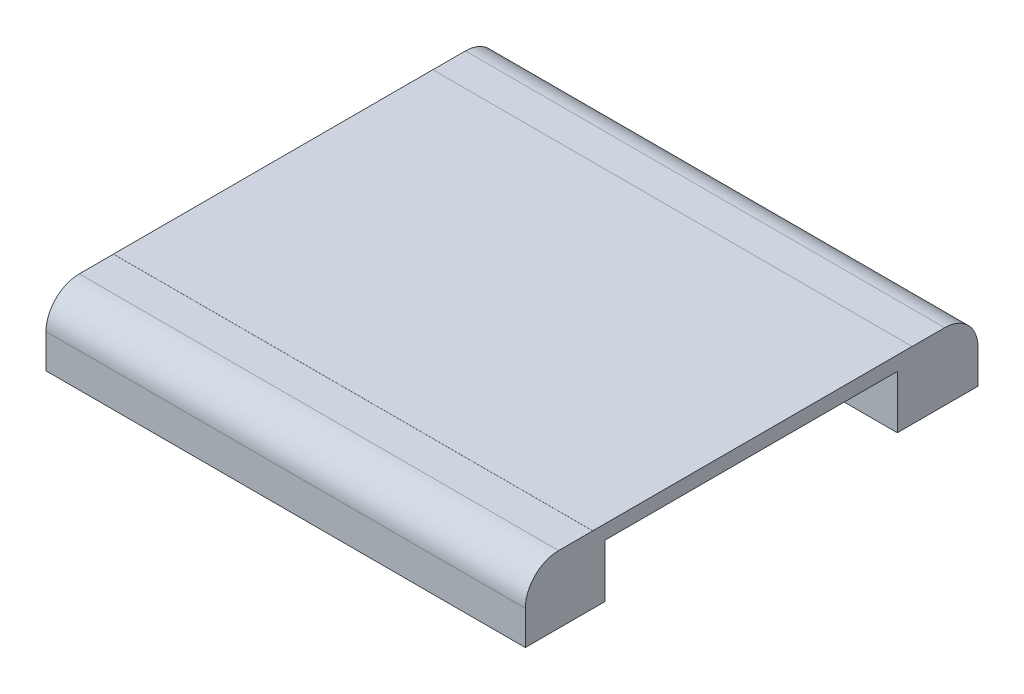
ISO-10303-21;
HEADER;
FILE_DESCRIPTION(('STEP AP214'),'2;1');
FILE_NAME('part.step','',(''),(''),'','','');
FILE_SCHEMA(('AUTOMOTIVE_DESIGN { 1 0 10303 214 1 1 1 1 }'));
ENDSEC;
DATA;
#1=APPLICATION_CONTEXT('core data for automotive mechanical design processes');
#2=APPLICATION_PROTOCOL_DEFINITION('international standard','automotive_design',2000,#1);
#3=PRODUCT_CONTEXT('',#1,'mechanical');
#4=PRODUCT('Part','Part','',(#3));
#5=PRODUCT_RELATED_PRODUCT_CATEGORY('part','',(#4));
#6=PRODUCT_DEFINITION_FORMATION('','',#4);
#7=PRODUCT_DEFINITION_CONTEXT('part definition',#1,'design');
#8=PRODUCT_DEFINITION('design','',#6,#7);
#9=PRODUCT_DEFINITION_SHAPE('','',#8);
#10=(LENGTH_UNIT() NAMED_UNIT(*) SI_UNIT(.MILLI.,.METRE.));
#11=(NAMED_UNIT(*) PLANE_ANGLE_UNIT() SI_UNIT($,.RADIAN.));
#12=(NAMED_UNIT(*) SI_UNIT($,.STERADIAN.) SOLID_ANGLE_UNIT());
#13=UNCERTAINTY_MEASURE_WITH_UNIT(LENGTH_MEASURE(1.E-05),#10,'distance_accuracy_value','');
#14=(GEOMETRIC_REPRESENTATION_CONTEXT(3) GLOBAL_UNCERTAINTY_ASSIGNED_CONTEXT((#13)) GLOBAL_UNIT_ASSIGNED_CONTEXT((#10,
#11,#12)) REPRESENTATION_CONTEXT('',''));
#15=CARTESIAN_POINT('',(0.,0.,0.));
#16=DIRECTION('',(0.,0.,1.));
#17=DIRECTION('',(1.,0.,0.));
#18=AXIS2_PLACEMENT_3D('',#15,#16,#17);
#19=CARTESIAN_POINT('',(18.,-0.0578125220072959,28.0241501159373));
#20=DIRECTION('',(0.,1.,0.));
#21=DIRECTION('',(0.,0.,1.));
#22=AXIS2_PLACEMENT_3D('',#19,#20,#21);
#23=PLANE('',#22);
#24=DIRECTION('',(0.,0.,-1.));
#25=VECTOR('',#24,1.);
#26=CARTESIAN_POINT('',(-18.,-0.0578125220072959,34.));
#27=LINE('',#26,#25);
#28=CARTESIAN_POINT('',(-18.,-0.0578125220072959,34.));
#29=VERTEX_POINT('',#28);
#30=CARTESIAN_POINT('',(-18.,-0.0578125220072959,28.0241501159373));
#31=VERTEX_POINT('',#30);
#32=EDGE_CURVE('E454',#29,#31,#27,.T.);
#33=ORIENTED_EDGE('',*,*,#32,.T.);
#34=DIRECTION('',(1.,0.,0.));
#35=VECTOR('',#34,1.);
#36=CARTESIAN_POINT('',(-40.325568237644,-0.0578125220072959,28.0241501159373));
#37=LINE('',#36,#35);
#38=CARTESIAN_POINT('',(18.,-0.0578125220072959,28.0241501159373));
#39=VERTEX_POINT('',#38);
#40=EDGE_CURVE('E11',#31,#39,#37,.T.);
#41=ORIENTED_EDGE('',*,*,#40,.T.);
#42=DIRECTION('',(0.,0.,-1.));
#43=VECTOR('',#42,1.);
#44=CARTESIAN_POINT('',(18.,-0.0578125220072959,34.));
#45=LINE('',#44,#43);
#46=CARTESIAN_POINT('',(18.,-0.0578125220072959,34.));
#47=VERTEX_POINT('',#46);
#48=EDGE_CURVE('E53',#47,#39,#45,.T.);
#49=ORIENTED_EDGE('',*,*,#48,.F.);
#50=DIRECTION('',(-1.,0.,0.));
#51=VECTOR('',#50,1.);
#52=CARTESIAN_POINT('',(0.,-0.0578125220072959,34.));
#53=LINE('',#52,#51);
#54=EDGE_CURVE('E453',#47,#29,#53,.T.);
#55=ORIENTED_EDGE('',*,*,#54,.T.);
#56=EDGE_LOOP('',(#33,#41,#49,#55));
#57=FACE_BOUND('',#56,.T.);
#58=DIRECTION('',(0.,0.,-1.));
#59=VECTOR('',#58,1.);
#60=CARTESIAN_POINT('',(17.,-0.0578125220072959,34.));
#61=LINE('',#60,#59);
#62=CARTESIAN_POINT('',(17.,-0.0578125220072959,33.));
#63=VERTEX_POINT('',#62);
#64=CARTESIAN_POINT('',(17.,-0.0578125220072959,28.9356904364668));
#65=VERTEX_POINT('',#64);
#66=EDGE_CURVE('E485',#63,#65,#61,.T.);
#67=ORIENTED_EDGE('',*,*,#66,.T.);
#68=DIRECTION('',(1.,0.,0.));
#69=VECTOR('',#68,1.);
#70=CARTESIAN_POINT('',(42.7233396122521,-0.0578125220072959,28.9356904364668));
#71=LINE('',#70,#69);
#72=CARTESIAN_POINT('',(-17.,-0.0578125220072959,28.9356904364668));
#73=VERTEX_POINT('',#72);
#74=EDGE_CURVE('E478',#73,#65,#71,.T.);
#75=ORIENTED_EDGE('',*,*,#74,.F.);
#76=DIRECTION('',(0.,0.,-1.));
#77=VECTOR('',#76,1.);
#78=CARTESIAN_POINT('',(-17.,-0.0578125220072959,34.));
#79=LINE('',#78,#77);
#80=CARTESIAN_POINT('',(-17.,-0.0578125220072959,33.));
#81=VERTEX_POINT('',#80);
#82=EDGE_CURVE('E467',#81,#73,#79,.T.);
#83=ORIENTED_EDGE('',*,*,#82,.F.);
#84=DIRECTION('',(-1.,0.,0.));
#85=VECTOR('',#84,1.);
#86=CARTESIAN_POINT('',(0.,-0.0578125220072959,33.));
#87=LINE('',#86,#85);
#88=CARTESIAN_POINT('',(7.80627689891058,-0.0578125220072959,33.));
#89=VERTEX_POINT('',#88);
#90=EDGE_CURVE('E468',#89,#81,#87,.T.);
#91=ORIENTED_EDGE('',*,*,#90,.F.);
#92=DIRECTION('',(-0.707040858821482,0.,0.707172697406356));
#93=VECTOR('',#92,1.);
#94=CARTESIAN_POINT('',(7.80627689891058,-0.0578125220072959,33.));
#95=LINE('',#94,#93);
#96=CARTESIAN_POINT('',(7.83796469042223,-0.0578125220072959,32.9683062998148));
#97=VERTEX_POINT('',#96);
#98=EDGE_CURVE('E449',#97,#89,#95,.T.);
#99=ORIENTED_EDGE('',*,*,#98,.F.);
#100=DIRECTION('',(1.,0.,0.));
#101=VECTOR('',#100,1.);
#102=CARTESIAN_POINT('',(13.9400122350262,-0.0578125220072959,32.9683062998148));
#103=LINE('',#102,#101);
#104=CARTESIAN_POINT('',(4.85968181109299,-0.0578125220072959,32.9683062998148));
#105=VERTEX_POINT('',#104);
#106=EDGE_CURVE('E464',#105,#97,#103,.T.);
#107=ORIENTED_EDGE('',*,*,#106,.F.);
#108=DIRECTION('',(-0.68267317744641,0.,0.73072384167702));
#109=VECTOR('',#108,1.);
#110=CARTESIAN_POINT('',(4.85968181109299,-0.0578125220072959,32.9683062998148));
#111=LINE('',#110,#109);
#112=CARTESIAN_POINT('',(7.40340874838498,-0.0578125220072959,30.2455364866692));
#113=VERTEX_POINT('',#112);
#114=EDGE_CURVE('E471',#113,#105,#111,.T.);
#115=ORIENTED_EDGE('',*,*,#114,.F.);
#116=DIRECTION('',(-1.,0.,0.));
#117=VECTOR('',#116,1.);
#118=CARTESIAN_POINT('',(12.3591776077276,-0.0578125220072959,30.2455364866692));
#119=LINE('',#118,#117);
#120=CARTESIAN_POINT('',(13.9400122350262,-0.0578125220072959,30.2455364866692));
#121=VERTEX_POINT('',#120);
#122=EDGE_CURVE('E474',#121,#113,#119,.T.);
#123=ORIENTED_EDGE('',*,*,#122,.F.);
#124=DIRECTION('',(0.,0.,-1.));
#125=VECTOR('',#124,1.);
#126=CARTESIAN_POINT('',(13.9400122350262,-0.0578125220072959,30.2455364866692));
#127=LINE('',#126,#125);
#128=CARTESIAN_POINT('',(13.9400122350262,-0.0578125220072959,32.9683062998148));
#129=VERTEX_POINT('',#128);
#130=EDGE_CURVE('E473',#129,#121,#127,.T.);
#131=ORIENTED_EDGE('',*,*,#130,.F.);
#132=DIRECTION('',(1.,0.,0.));
#133=VECTOR('',#132,1.);
#134=CARTESIAN_POINT('',(13.9400122350262,-0.0578125220072959,32.9683062998148));
#135=LINE('',#134,#133);
#136=CARTESIAN_POINT('',(11.5237850289689,-0.0578125220072959,32.9683062998148));
#137=VERTEX_POINT('',#136);
#138=EDGE_CURVE('E466',#137,#129,#135,.T.);
#139=ORIENTED_EDGE('',*,*,#138,.F.);
#140=DIRECTION('',(0.,0.,-1.));
#141=VECTOR('',#140,1.);
#142=CARTESIAN_POINT('',(11.5237850289689,-0.0578125220072959,31.9372937490459));
#143=LINE('',#142,#141);
#144=CARTESIAN_POINT('',(11.5237850289689,-0.0578125220072959,33.));
#145=VERTEX_POINT('',#144);
#146=EDGE_CURVE('E463',#145,#137,#143,.T.);
#147=ORIENTED_EDGE('',*,*,#146,.F.);
#148=DIRECTION('',(-1.,0.,0.));
#149=VECTOR('',#148,1.);
#150=CARTESIAN_POINT('',(0.,-0.0578125220072959,33.));
#151=LINE('',#150,#149);
#152=EDGE_CURVE('E470',#63,#145,#151,.T.);
#153=ORIENTED_EDGE('',*,*,#152,.F.);
#154=EDGE_LOOP('',(#67,#75,#83,#91,#99,#107,#115,#123,#131,#139,#147,#153));
#155=FACE_BOUND('',#154,.T.);
#156=ADVANCED_FACE('F36',(#57,#155),#23,.F.);
#157=DIRECTION('',(1.,0.,0.));
#158=VECTOR('',#157,1.);
#159=CARTESIAN_POINT('',(-40.325568237644,-0.0578125220072959,6.05869530103713));
#160=LINE('',#159,#158);
#161=CARTESIAN_POINT('',(-18.,-0.0578125220072959,6.05869530103713));
#162=VERTEX_POINT('',#161);
#163=CARTESIAN_POINT('',(18.,-0.0578125220072959,6.05869530103713));
#164=VERTEX_POINT('',#163);
#165=EDGE_CURVE('E278',#162,#164,#160,.T.);
#166=ORIENTED_EDGE('',*,*,#165,.F.);
#167=CARTESIAN_POINT('',(-18.,-0.0578125220072959,0.));
#168=VERTEX_POINT('',#167);
#169=EDGE_CURVE('E450',#162,#168,#27,.T.);
#170=ORIENTED_EDGE('',*,*,#169,.T.);
#171=DIRECTION('',(-1.,0.,0.));
#172=VECTOR('',#171,1.);
#173=CARTESIAN_POINT('',(0.,-0.0578125220072959,0.));
#174=LINE('',#173,#172);
#175=CARTESIAN_POINT('',(18.,-0.0578125220072959,0.));
#176=VERTEX_POINT('',#175);
#177=EDGE_CURVE('E455',#176,#168,#174,.T.);
#178=ORIENTED_EDGE('',*,*,#177,.F.);
#179=EDGE_CURVE('E457',#164,#176,#45,.T.);
#180=ORIENTED_EDGE('',*,*,#179,.F.);
#181=EDGE_LOOP('',(#166,#170,#178,#180));
#182=FACE_BOUND('',#181,.T.);
#183=DIRECTION('',(-1.,0.,0.));
#184=VECTOR('',#183,1.);
#185=CARTESIAN_POINT('',(42.7233396122521,-0.0578125220072959,4.950527908569));
#186=LINE('',#185,#184);
#187=CARTESIAN_POINT('',(17.,-0.0578125220072959,4.95052790856901));
#188=VERTEX_POINT('',#187);
#189=CARTESIAN_POINT('',(-17.,-0.0578125220072959,4.95052790856901));
#190=VERTEX_POINT('',#189);
#191=EDGE_CURVE('E40',#188,#190,#186,.T.);
#192=ORIENTED_EDGE('',*,*,#191,.F.);
#193=CARTESIAN_POINT('',(17.,-0.0578125220072959,1.));
#194=VERTEX_POINT('',#193);
#195=EDGE_CURVE('E481',#188,#194,#61,.T.);
#196=ORIENTED_EDGE('',*,*,#195,.T.);
#197=DIRECTION('',(-1.,0.,0.));
#198=VECTOR('',#197,1.);
#199=CARTESIAN_POINT('',(0.,-0.0578125220072959,1.));
#200=LINE('',#199,#198);
#201=CARTESIAN_POINT('',(2.52238131463829,-0.0578125220072959,1.));
#202=VERTEX_POINT('',#201);
#203=EDGE_CURVE('E495',#194,#202,#200,.T.);
#204=ORIENTED_EDGE('',*,*,#203,.T.);
#205=DIRECTION('',(-0.756635368845266,0.,0.653837073445968));
#206=VECTOR('',#205,1.);
#207=CARTESIAN_POINT('',(2.54458171045212,-0.0578125220072959,0.980815803191426));
#208=LINE('',#207,#206);
#209=CARTESIAN_POINT('',(-0.105019187153202,-0.0578125220072959,3.27043556988826));
#210=VERTEX_POINT('',#209);
#211=EDGE_CURVE('E461',#202,#210,#208,.T.);
#212=ORIENTED_EDGE('',*,*,#211,.T.);
#213=DIRECTION('',(-1.,0.,0.));
#214=VECTOR('',#213,1.);
#215=CARTESIAN_POINT('',(-0.105019187153202,-0.0578125220072959,3.27043556988826));
#216=LINE('',#215,#214);
#217=CARTESIAN_POINT('',(-3.68350976570056,-0.0578125220072959,3.27043556988826));
#218=VERTEX_POINT('',#217);
#219=EDGE_CURVE('E490',#210,#218,#216,.T.);
#220=ORIENTED_EDGE('',*,*,#219,.T.);
#221=DIRECTION('',(-0.653837073445968,0.,-0.756635368845266));
#222=VECTOR('',#221,1.);
#223=CARTESIAN_POINT('',(-3.68350976570056,-0.0578125220072959,3.27043556988826));
#224=LINE('',#223,#222);
#225=CARTESIAN_POINT('',(-5.64547851523037,-0.0578125220072959,1.));
#226=VERTEX_POINT('',#225);
#227=EDGE_CURVE('E45',#218,#226,#224,.T.);
#228=ORIENTED_EDGE('',*,*,#227,.T.);
#229=DIRECTION('',(-1.,0.,0.));
#230=VECTOR('',#229,1.);
#231=CARTESIAN_POINT('',(0.,-0.0578125220072959,1.));
#232=LINE('',#231,#230);
#233=CARTESIAN_POINT('',(-17.,-0.0578125220072959,1.));
#234=VERTEX_POINT('',#233);
#235=EDGE_CURVE('E484',#226,#234,#232,.T.);
#236=ORIENTED_EDGE('',*,*,#235,.T.);
#237=EDGE_CURVE('E459',#190,#234,#79,.T.);
#238=ORIENTED_EDGE('',*,*,#237,.F.);
#239=EDGE_LOOP('',(#192,#196,#204,#212,#220,#228,#236,#238));
#240=FACE_BOUND('',#239,.T.);
#241=ADVANCED_FACE('F38',(#182,#240),#23,.F.);
#242=CARTESIAN_POINT('',(-18.,5.,34.));
#243=DIRECTION('',(0.,1.,0.));
#244=DIRECTION('',(0.,0.,1.));
#245=AXIS2_PLACEMENT_3D('',#242,#243,#244);
#246=PLANE('',#245);
#247=DIRECTION('',(0.,0.,-1.));
#248=VECTOR('',#247,1.);
#249=CARTESIAN_POINT('',(-18.,5.,34.));
#250=LINE('',#249,#248);
#251=CARTESIAN_POINT('',(-18.,5.,31.5));
#252=VERTEX_POINT('',#251);
#253=CARTESIAN_POINT('',(-18.,5.,28.9356904364668));
#254=VERTEX_POINT('',#253);
#255=EDGE_CURVE('E412',#252,#254,#250,.T.);
#256=ORIENTED_EDGE('',*,*,#255,.F.);
#257=DIRECTION('',(1.,0.,0.));
#258=VECTOR('',#257,1.);
#259=CARTESIAN_POINT('',(-18.,5.,31.5));
#260=LINE('',#259,#258);
#261=CARTESIAN_POINT('',(18.,5.,31.5));
#262=VERTEX_POINT('',#261);
#263=EDGE_CURVE('E422',#252,#262,#260,.T.);
#264=ORIENTED_EDGE('',*,*,#263,.T.);
#265=DIRECTION('',(0.,0.,-1.));
#266=VECTOR('',#265,1.);
#267=CARTESIAN_POINT('',(18.,5.,34.));
#268=LINE('',#267,#266);
#269=CARTESIAN_POINT('',(18.,5.,28.9356904364668));
#270=VERTEX_POINT('',#269);
#271=EDGE_CURVE('E416',#262,#270,#268,.T.);
#272=ORIENTED_EDGE('',*,*,#271,.T.);
#273=DIRECTION('',(-1.,0.,0.));
#274=VECTOR('',#273,1.);
#275=CARTESIAN_POINT('',(-18.,5.,28.9356904364668));
#276=LINE('',#275,#274);
#277=EDGE_CURVE('E376',#270,#254,#276,.T.);
#278=ORIENTED_EDGE('',*,*,#277,.T.);
#279=EDGE_LOOP('',(#256,#264,#272,#278));
#280=FACE_BOUND('',#279,.T.);
#281=ADVANCED_FACE('F545',(#280),#246,.T.);
#282=CARTESIAN_POINT('',(42.7233396122521,5.00470007375512,28.9356904364668));
#283=DIRECTION('',(0.,0.,-1.));
#284=DIRECTION('',(0.,1.,0.));
#285=AXIS2_PLACEMENT_3D('',#282,#283,#284);
#286=PLANE('',#285);
#287=ORIENTED_EDGE('',*,*,#277,.F.);
#288=DIRECTION('',(0.,1.,0.));
#289=VECTOR('',#288,1.);
#290=CARTESIAN_POINT('',(18.,5.00470007375512,28.9356904364668));
#291=LINE('',#290,#289);
#292=CARTESIAN_POINT('',(18.,5.00470007375512,28.9356904364668));
#293=VERTEX_POINT('',#292);
#294=EDGE_CURVE('E352',#270,#293,#291,.T.);
#295=ORIENTED_EDGE('',*,*,#294,.T.);
#296=DIRECTION('',(-1.,0.,0.));
#297=VECTOR('',#296,1.);
#298=CARTESIAN_POINT('',(42.7233396122521,5.00470007375512,28.9356904364668));
#299=LINE('',#298,#297);
#300=CARTESIAN_POINT('',(-18.,5.00470007375512,28.9356904364668));
#301=VERTEX_POINT('',#300);
#302=EDGE_CURVE('E349',#293,#301,#299,.T.);
#303=ORIENTED_EDGE('',*,*,#302,.T.);
#304=DIRECTION('',(0.,-1.,0.));
#305=VECTOR('',#304,1.);
#306=CARTESIAN_POINT('',(-18.,5.00470007375513,28.9356904364668));
#307=LINE('',#306,#305);
#308=EDGE_CURVE('E346',#301,#254,#307,.T.);
#309=ORIENTED_EDGE('',*,*,#308,.T.);
#310=EDGE_LOOP('',(#287,#295,#303,#309));
#311=FACE_BOUND('',#310,.T.);
#312=ADVANCED_FACE('F660',(#311),#286,.F.);
#313=CARTESIAN_POINT('',(42.7233396122521,5.00470007375512,28.9356904364668));
#314=DIRECTION('',(0.,-1.,0.));
#315=DIRECTION('',(0.,0.,-1.));
#316=AXIS2_PLACEMENT_3D('',#313,#314,#315);
#317=PLANE('',#316);
#318=ORIENTED_EDGE('',*,*,#302,.F.);
#319=DIRECTION('',(0.,0.,-1.));
#320=VECTOR('',#319,1.);
#321=CARTESIAN_POINT('',(18.,5.00470007375512,28.9356904364668));
#322=LINE('',#321,#320);
#323=CARTESIAN_POINT('',(18.,5.00470007375512,4.95052790856901));
#324=VERTEX_POINT('',#323);
#325=EDGE_CURVE('E354',#293,#324,#322,.T.);
#326=ORIENTED_EDGE('',*,*,#325,.T.);
#327=DIRECTION('',(-1.,0.,0.));
#328=VECTOR('',#327,1.);
#329=CARTESIAN_POINT('',(42.7233396122521,5.00470007375512,4.950527908569));
#330=LINE('',#329,#328);
#331=CARTESIAN_POINT('',(-18.,5.00470007375512,4.95052790856901));
#332=VERTEX_POINT('',#331);
#333=EDGE_CURVE('E355',#324,#332,#330,.T.);
#334=ORIENTED_EDGE('',*,*,#333,.T.);
#335=DIRECTION('',(0.,0.,1.));
#336=VECTOR('',#335,1.);
#337=CARTESIAN_POINT('',(-18.,5.00470007375512,28.9356904364668));
#338=LINE('',#337,#336);
#339=EDGE_CURVE('E343',#332,#301,#338,.T.);
#340=ORIENTED_EDGE('',*,*,#339,.T.);
#341=EDGE_LOOP('',(#318,#326,#334,#340));
#342=FACE_BOUND('',#341,.T.);
#343=ADVANCED_FACE('F690',(#342),#317,.F.);
#344=CARTESIAN_POINT('',(42.7233396122521,5.00470007375512,4.950527908569));
#345=DIRECTION('',(0.,0.,1.));
#346=DIRECTION('',(0.,-1.,0.));
#347=AXIS2_PLACEMENT_3D('',#344,#345,#346);
#348=PLANE('',#347);
#349=DIRECTION('',(1.,0.,0.));
#350=VECTOR('',#349,1.);
#351=CARTESIAN_POINT('',(-18.,5.,4.950527908569));
#352=LINE('',#351,#350);
#353=CARTESIAN_POINT('',(-18.,5.,4.95052790856901));
#354=VERTEX_POINT('',#353);
#355=CARTESIAN_POINT('',(18.,5.,4.950527908569));
#356=VERTEX_POINT('',#355);
#357=EDGE_CURVE('E368',#354,#356,#352,.T.);
#358=ORIENTED_EDGE('',*,*,#357,.F.);
#359=DIRECTION('',(0.,1.,0.));
#360=VECTOR('',#359,1.);
#361=CARTESIAN_POINT('',(-18.,5.00470007375513,4.950527908569));
#362=LINE('',#361,#360);
#363=EDGE_CURVE('E347',#354,#332,#362,.T.);
#364=ORIENTED_EDGE('',*,*,#363,.T.);
#365=ORIENTED_EDGE('',*,*,#333,.F.);
#366=DIRECTION('',(0.,-1.,0.));
#367=VECTOR('',#366,1.);
#368=CARTESIAN_POINT('',(18.,5.00470007375512,4.950527908569));
#369=LINE('',#368,#367);
#370=EDGE_CURVE('E358',#324,#356,#369,.T.);
#371=ORIENTED_EDGE('',*,*,#370,.T.);
#372=EDGE_LOOP('',(#358,#364,#365,#371));
#373=FACE_BOUND('',#372,.T.);
#374=ADVANCED_FACE('F687',(#373),#348,.F.);
#375=CARTESIAN_POINT('',(18.,5.,2.5));
#376=VERTEX_POINT('',#375);
#377=EDGE_CURVE('E409',#356,#376,#268,.T.);
#378=ORIENTED_EDGE('',*,*,#377,.T.);
#379=DIRECTION('',(-1.,0.,0.));
#380=VECTOR('',#379,1.);
#381=CARTESIAN_POINT('',(-18.,5.,2.5));
#382=LINE('',#381,#380);
#383=CARTESIAN_POINT('',(-18.,5.,2.5));
#384=VERTEX_POINT('',#383);
#385=EDGE_CURVE('E438',#376,#384,#382,.T.);
#386=ORIENTED_EDGE('',*,*,#385,.T.);
#387=EDGE_CURVE('E415',#354,#384,#250,.T.);
#388=ORIENTED_EDGE('',*,*,#387,.F.);
#389=ORIENTED_EDGE('',*,*,#357,.T.);
#390=EDGE_LOOP('',(#378,#386,#388,#389));
#391=FACE_BOUND('',#390,.T.);
#392=ADVANCED_FACE('F662',(#391),#246,.T.);
#393=CARTESIAN_POINT('',(-18.,2.5,31.5));
#394=DIRECTION('',(1.,0.,0.));
#395=DIRECTION('',(0.,0.,-1.));
#396=AXIS2_PLACEMENT_3D('',#393,#394,#395);
#397=CYLINDRICAL_SURFACE('',#396,2.5);
#398=ORIENTED_EDGE('',*,*,#263,.F.);
#399=CARTESIAN_POINT('',(-18.,2.5,31.5));
#400=DIRECTION('',(-1.,0.,0.));
#401=DIRECTION('',(0.,-1.,0.));
#402=AXIS2_PLACEMENT_3D('',#399,#400,#401);
#403=CIRCLE('',#402,2.5);
#404=CARTESIAN_POINT('',(-18.,2.5,34.));
#405=VERTEX_POINT('',#404);
#406=EDGE_CURVE('E428',#405,#252,#403,.T.);
#407=ORIENTED_EDGE('',*,*,#406,.F.);
#408=DIRECTION('',(1.,0.,0.));
#409=VECTOR('',#408,1.);
#410=CARTESIAN_POINT('',(0.,2.5,34.));
#411=LINE('',#410,#409);
#412=CARTESIAN_POINT('',(18.,2.5,34.));
#413=VERTEX_POINT('',#412);
#414=EDGE_CURVE('E425',#413,#405,#411,.F.);
#415=ORIENTED_EDGE('',*,*,#414,.F.);
#416=CARTESIAN_POINT('',(18.,2.5,31.5));
#417=DIRECTION('',(-1.,0.,0.));
#418=DIRECTION('',(0.,0.,1.));
#419=AXIS2_PLACEMENT_3D('',#416,#417,#418);
#420=CIRCLE('',#419,2.5);
#421=EDGE_CURVE('E430',#262,#413,#420,.F.);
#422=ORIENTED_EDGE('',*,*,#421,.F.);
#423=EDGE_LOOP('',(#398,#407,#415,#422));
#424=FACE_BOUND('',#423,.T.);
#425=ADVANCED_FACE('F663',(#424),#397,.T.);
#426=CARTESIAN_POINT('',(-18.,2.5,2.5));
#427=DIRECTION('',(1.,0.,0.));
#428=DIRECTION('',(0.,0.,-1.));
#429=AXIS2_PLACEMENT_3D('',#426,#427,#428);
#430=CYLINDRICAL_SURFACE('',#429,2.5);
#431=ORIENTED_EDGE('',*,*,#385,.F.);
#432=CARTESIAN_POINT('',(18.,2.5,2.5));
#433=DIRECTION('',(-1.,0.,0.));
#434=DIRECTION('',(0.,0.,1.));
#435=AXIS2_PLACEMENT_3D('',#432,#433,#434);
#436=CIRCLE('',#435,2.5);
#437=CARTESIAN_POINT('',(18.,2.5,0.));
#438=VERTEX_POINT('',#437);
#439=EDGE_CURVE('E444',#438,#376,#436,.F.);
#440=ORIENTED_EDGE('',*,*,#439,.F.);
#441=DIRECTION('',(-1.,0.,0.));
#442=VECTOR('',#441,1.);
#443=CARTESIAN_POINT('',(-18.,2.5,0.));
#444=LINE('',#443,#442);
#445=CARTESIAN_POINT('',(-18.,2.5,0.));
#446=VERTEX_POINT('',#445);
#447=EDGE_CURVE('E441',#446,#438,#444,.F.);
#448=ORIENTED_EDGE('',*,*,#447,.F.);
#449=CARTESIAN_POINT('',(-18.,2.5,2.5));
#450=DIRECTION('',(-1.,0.,0.));
#451=DIRECTION('',(0.,-1.,0.));
#452=AXIS2_PLACEMENT_3D('',#449,#450,#451);
#453=CIRCLE('',#452,2.5);
#454=EDGE_CURVE('E446',#384,#446,#453,.T.);
#455=ORIENTED_EDGE('',*,*,#454,.F.);
#456=EDGE_LOOP('',(#431,#440,#448,#455));
#457=FACE_BOUND('',#456,.T.);
#458=ADVANCED_FACE('F654',(#457),#430,.T.);
#459=CARTESIAN_POINT('',(-18.,-5.,34.));
#460=DIRECTION('',(-1.,0.,0.));
#461=DIRECTION('',(0.,-1.,0.));
#462=AXIS2_PLACEMENT_3D('',#459,#460,#461);
#463=PLANE('',#462);
#464=ORIENTED_EDGE('',*,*,#32,.F.);
#465=DIRECTION('',(0.,1.,0.));
#466=VECTOR('',#465,1.);
#467=CARTESIAN_POINT('',(-18.,-5.,34.));
#468=LINE('',#467,#466);
#469=EDGE_CURVE('E406',#29,#405,#468,.T.);
#470=ORIENTED_EDGE('',*,*,#469,.T.);
#471=ORIENTED_EDGE('',*,*,#406,.T.);
#472=ORIENTED_EDGE('',*,*,#255,.T.);
#473=ORIENTED_EDGE('',*,*,#308,.F.);
#474=ORIENTED_EDGE('',*,*,#339,.F.);
#475=ORIENTED_EDGE('',*,*,#363,.F.);
#476=ORIENTED_EDGE('',*,*,#387,.T.);
#477=ORIENTED_EDGE('',*,*,#454,.T.);
#478=DIRECTION('',(0.,1.,0.));
#479=VECTOR('',#478,1.);
#480=CARTESIAN_POINT('',(-18.,-5.,0.));
#481=LINE('',#480,#479);
#482=EDGE_CURVE('E407',#168,#446,#481,.T.);
#483=ORIENTED_EDGE('',*,*,#482,.F.);
#484=ORIENTED_EDGE('',*,*,#169,.F.);
#485=DIRECTION('',(0.,1.,0.));
#486=VECTOR('',#485,1.);
#487=CARTESIAN_POINT('',(-18.,3.93590653524728,6.05869530103713));
#488=LINE('',#487,#486);
#489=CARTESIAN_POINT('',(-18.,3.93590653524727,6.05869530103713));
#490=VERTEX_POINT('',#489);
#491=EDGE_CURVE('E271',#162,#490,#488,.T.);
#492=ORIENTED_EDGE('',*,*,#491,.T.);
#493=DIRECTION('',(0.,0.,1.));
#494=VECTOR('',#493,1.);
#495=CARTESIAN_POINT('',(-18.,3.93590653524727,28.0241501159373));
#496=LINE('',#495,#494);
#497=CARTESIAN_POINT('',(-18.,3.93590653524727,28.0241501159373));
#498=VERTEX_POINT('',#497);
#499=EDGE_CURVE('E266',#490,#498,#496,.T.);
#500=ORIENTED_EDGE('',*,*,#499,.T.);
#501=DIRECTION('',(0.,-1.,0.));
#502=VECTOR('',#501,1.);
#503=CARTESIAN_POINT('',(-18.,3.93590653524728,28.0241501159373));
#504=LINE('',#503,#502);
#505=EDGE_CURVE('E288',#498,#31,#504,.T.);
#506=ORIENTED_EDGE('',*,*,#505,.T.);
#507=EDGE_LOOP('',(#464,#470,#471,#472,#473,#474,#475,#476,#477,#483,#484,#492,#500,#506));
#508=FACE_BOUND('',#507,.T.);
#509=ADVANCED_FACE('F651',(#508),#463,.T.);
#510=CARTESIAN_POINT('',(-40.325568237644,3.93590653524727,28.0241501159373));
#511=DIRECTION('',(0.,1.,0.));
#512=DIRECTION('',(0.,0.,1.));
#513=AXIS2_PLACEMENT_3D('',#510,#511,#512);
#514=PLANE('',#513);
#515=DIRECTION('',(1.,0.,0.));
#516=VECTOR('',#515,1.);
#517=CARTESIAN_POINT('',(-40.325568237644,3.93590653524727,6.05869530103713));
#518=LINE('',#517,#516);
#519=CARTESIAN_POINT('',(18.,3.93590653524727,6.05869530103713));
#520=VERTEX_POINT('',#519);
#521=EDGE_CURVE('E259',#490,#520,#518,.T.);
#522=ORIENTED_EDGE('',*,*,#521,.T.);
#523=DIRECTION('',(0.,0.,-1.));
#524=VECTOR('',#523,1.);
#525=CARTESIAN_POINT('',(18.,3.93590653524727,28.0241501159373));
#526=LINE('',#525,#524);
#527=CARTESIAN_POINT('',(18.,3.93590653524727,28.0241501159373));
#528=VERTEX_POINT('',#527);
#529=EDGE_CURVE('E264',#528,#520,#526,.T.);
#530=ORIENTED_EDGE('',*,*,#529,.F.);
#531=DIRECTION('',(1.,0.,0.));
#532=VECTOR('',#531,1.);
#533=CARTESIAN_POINT('',(-40.325568237644,3.93590653524727,28.0241501159373));
#534=LINE('',#533,#532);
#535=EDGE_CURVE('E286',#498,#528,#534,.T.);
#536=ORIENTED_EDGE('',*,*,#535,.F.);
#537=ORIENTED_EDGE('',*,*,#499,.F.);
#538=EDGE_LOOP('',(#522,#530,#536,#537));
#539=FACE_BOUND('',#538,.T.);
#540=ADVANCED_FACE('F261',(#539),#514,.F.);
#541=CARTESIAN_POINT('',(18.,-5.,34.));
#542=DIRECTION('',(-1.,0.,0.));
#543=DIRECTION('',(0.,0.,1.));
#544=AXIS2_PLACEMENT_3D('',#541,#542,#543);
#545=PLANE('',#544);
#546=DIRECTION('',(0.,1.,0.));
#547=VECTOR('',#546,1.);
#548=CARTESIAN_POINT('',(18.,-5.,34.));
#549=LINE('',#548,#547);
#550=EDGE_CURVE('E404',#47,#413,#549,.T.);
#551=ORIENTED_EDGE('',*,*,#550,.F.);
#552=ORIENTED_EDGE('',*,*,#48,.T.);
#553=DIRECTION('',(0.,1.,0.));
#554=VECTOR('',#553,1.);
#555=CARTESIAN_POINT('',(18.,3.93590653524727,28.0241501159373));
#556=LINE('',#555,#554);
#557=EDGE_CURVE('E281',#39,#528,#556,.T.);
#558=ORIENTED_EDGE('',*,*,#557,.T.);
#559=ORIENTED_EDGE('',*,*,#529,.T.);
#560=DIRECTION('',(0.,-1.,0.));
#561=VECTOR('',#560,1.);
#562=CARTESIAN_POINT('',(18.,3.93590653524727,6.05869530103713));
#563=LINE('',#562,#561);
#564=EDGE_CURVE('E275',#520,#164,#563,.T.);
#565=ORIENTED_EDGE('',*,*,#564,.T.);
#566=ORIENTED_EDGE('',*,*,#179,.T.);
#567=DIRECTION('',(0.,1.,0.));
#568=VECTOR('',#567,1.);
#569=CARTESIAN_POINT('',(18.,-5.,0.));
#570=LINE('',#569,#568);
#571=EDGE_CURVE('E387',#176,#438,#570,.T.);
#572=ORIENTED_EDGE('',*,*,#571,.T.);
#573=ORIENTED_EDGE('',*,*,#439,.T.);
#574=ORIENTED_EDGE('',*,*,#377,.F.);
#575=ORIENTED_EDGE('',*,*,#370,.F.);
#576=ORIENTED_EDGE('',*,*,#325,.F.);
#577=ORIENTED_EDGE('',*,*,#294,.F.);
#578=ORIENTED_EDGE('',*,*,#271,.F.);
#579=ORIENTED_EDGE('',*,*,#421,.T.);
#580=EDGE_LOOP('',(#551,#552,#558,#559,#565,#566,#572,#573,#574,#575,#576,#577,#578,#579));
#581=FACE_BOUND('',#580,.T.);
#582=ADVANCED_FACE('F280',(#581),#545,.F.);
#583=CARTESIAN_POINT('',(-40.325568237644,3.93590653524727,6.05869530103713));
#584=DIRECTION('',(0.,0.,-1.));
#585=DIRECTION('',(-1.,0.,0.));
#586=AXIS2_PLACEMENT_3D('',#583,#584,#585);
#587=PLANE('',#586);
#588=ORIENTED_EDGE('',*,*,#165,.T.);
#589=ORIENTED_EDGE('',*,*,#564,.F.);
#590=ORIENTED_EDGE('',*,*,#521,.F.);
#591=ORIENTED_EDGE('',*,*,#491,.F.);
#592=EDGE_LOOP('',(#588,#589,#590,#591));
#593=FACE_BOUND('',#592,.T.);
#594=ADVANCED_FACE('F276',(#593),#587,.F.);
#595=CARTESIAN_POINT('',(-40.325568237644,3.93590653524727,28.0241501159373));
#596=DIRECTION('',(0.,0.,1.));
#597=DIRECTION('',(1.,0.,0.));
#598=AXIS2_PLACEMENT_3D('',#595,#596,#597);
#599=PLANE('',#598);
#600=ORIENTED_EDGE('',*,*,#535,.T.);
#601=ORIENTED_EDGE('',*,*,#557,.F.);
#602=ORIENTED_EDGE('',*,*,#40,.F.);
#603=ORIENTED_EDGE('',*,*,#505,.F.);
#604=EDGE_LOOP('',(#600,#601,#602,#603));
#605=FACE_BOUND('',#604,.T.);
#606=ADVANCED_FACE('F649',(#605),#599,.F.);
#607=CARTESIAN_POINT('',(0.,0.,0.));
#608=DIRECTION('',(0.,0.,1.));
#609=DIRECTION('',(1.,0.,0.));
#610=AXIS2_PLACEMENT_3D('',#607,#608,#609);
#611=PLANE('',#610);
#612=ORIENTED_EDGE('',*,*,#571,.F.);
#613=ORIENTED_EDGE('',*,*,#177,.T.);
#614=ORIENTED_EDGE('',*,*,#482,.T.);
#615=ORIENTED_EDGE('',*,*,#447,.T.);
#616=EDGE_LOOP('',(#612,#613,#614,#615));
#617=FACE_BOUND('',#616,.T.);
#618=ADVANCED_FACE('F633',(#617),#611,.F.);
#619=CARTESIAN_POINT('',(0.,0.,34.));
#620=DIRECTION('',(0.,0.,1.));
#621=DIRECTION('',(1.,0.,0.));
#622=AXIS2_PLACEMENT_3D('',#619,#620,#621);
#623=PLANE('',#622);
#624=ORIENTED_EDGE('',*,*,#54,.F.);
#625=ORIENTED_EDGE('',*,*,#550,.T.);
#626=ORIENTED_EDGE('',*,*,#414,.T.);
#627=ORIENTED_EDGE('',*,*,#469,.F.);
#628=EDGE_LOOP('',(#624,#625,#626,#627));
#629=FACE_BOUND('',#628,.T.);
#630=ADVANCED_FACE('F628',(#629),#623,.T.);
#631=CARTESIAN_POINT('',(-18.,4.,34.));
#632=DIRECTION('',(0.,1.,0.));
#633=DIRECTION('',(0.,0.,1.));
#634=AXIS2_PLACEMENT_3D('',#631,#632,#633);
#635=PLANE('',#634);
#636=DIRECTION('',(0.,0.,-1.));
#637=VECTOR('',#636,1.);
#638=CARTESIAN_POINT('',(11.5237850289689,4.,31.9372937490459));
#639=LINE('',#638,#637);
#640=CARTESIAN_POINT('',(11.5237850289689,4.,33.));
#641=VERTEX_POINT('',#640);
#642=CARTESIAN_POINT('',(11.5237850289689,4.,32.9683062998148));
#643=VERTEX_POINT('',#642);
#644=EDGE_CURVE('E293',#641,#643,#639,.T.);
#645=ORIENTED_EDGE('',*,*,#644,.T.);
#646=DIRECTION('',(-1.,0.,0.));
#647=VECTOR('',#646,1.);
#648=CARTESIAN_POINT('',(13.9400122350262,4.,32.9683062998148));
#649=LINE('',#648,#647);
#650=CARTESIAN_POINT('',(13.9400122350262,4.,32.9683062998148));
#651=VERTEX_POINT('',#650);
#652=EDGE_CURVE('E323',#651,#643,#649,.T.);
#653=ORIENTED_EDGE('',*,*,#652,.F.);
#654=DIRECTION('',(0.,0.,1.));
#655=VECTOR('',#654,1.);
#656=CARTESIAN_POINT('',(13.9400122350262,4.,30.2455364866692));
#657=LINE('',#656,#655);
#658=CARTESIAN_POINT('',(13.9400122350262,4.,30.2455364866692));
#659=VERTEX_POINT('',#658);
#660=EDGE_CURVE('E327',#659,#651,#657,.T.);
#661=ORIENTED_EDGE('',*,*,#660,.F.);
#662=DIRECTION('',(1.,0.,0.));
#663=VECTOR('',#662,1.);
#664=CARTESIAN_POINT('',(12.3591776077276,4.,30.2455364866692));
#665=LINE('',#664,#663);
#666=CARTESIAN_POINT('',(7.40340874838499,4.,30.2455364866692));
#667=VERTEX_POINT('',#666);
#668=EDGE_CURVE('E331',#667,#659,#665,.T.);
#669=ORIENTED_EDGE('',*,*,#668,.F.);
#670=DIRECTION('',(0.68267317744641,0.,-0.73072384167702));
#671=VECTOR('',#670,1.);
#672=CARTESIAN_POINT('',(4.85968181109299,4.,32.9683062998148));
#673=LINE('',#672,#671);
#674=CARTESIAN_POINT('',(4.85968181109299,4.,32.9683062998148));
#675=VERTEX_POINT('',#674);
#676=EDGE_CURVE('E326',#675,#667,#673,.T.);
#677=ORIENTED_EDGE('',*,*,#676,.F.);
#678=CARTESIAN_POINT('',(7.83796469042223,4.,32.9683062998148));
#679=VERTEX_POINT('',#678);
#680=EDGE_CURVE('E321',#679,#675,#649,.T.);
#681=ORIENTED_EDGE('',*,*,#680,.F.);
#682=DIRECTION('',(-0.707040858821482,0.,0.707172697406356));
#683=VECTOR('',#682,1.);
#684=CARTESIAN_POINT('',(7.80627689891058,4.,33.));
#685=LINE('',#684,#683);
#686=CARTESIAN_POINT('',(7.80627689891057,4.,33.));
#687=VERTEX_POINT('',#686);
#688=EDGE_CURVE('E297',#679,#687,#685,.T.);
#689=ORIENTED_EDGE('',*,*,#688,.T.);
#690=DIRECTION('',(1.,0.,0.));
#691=VECTOR('',#690,1.);
#692=CARTESIAN_POINT('',(-18.,4.,33.));
#693=LINE('',#692,#691);
#694=CARTESIAN_POINT('',(-17.,4.,33.));
#695=VERTEX_POINT('',#694);
#696=EDGE_CURVE('E389',#695,#687,#693,.T.);
#697=ORIENTED_EDGE('',*,*,#696,.F.);
#698=DIRECTION('',(0.,0.,-1.));
#699=VECTOR('',#698,1.);
#700=CARTESIAN_POINT('',(-17.,4.,34.));
#701=LINE('',#700,#699);
#702=CARTESIAN_POINT('',(-17.,4.,28.9356904364668));
#703=VERTEX_POINT('',#702);
#704=EDGE_CURVE('E384',#695,#703,#701,.T.);
#705=ORIENTED_EDGE('',*,*,#704,.T.);
#706=DIRECTION('',(-1.,0.,0.));
#707=VECTOR('',#706,1.);
#708=CARTESIAN_POINT('',(-18.,4.,28.9356904364668));
#709=LINE('',#708,#707);
#710=CARTESIAN_POINT('',(17.,4.,28.9356904364668));
#711=VERTEX_POINT('',#710);
#712=EDGE_CURVE('E371',#711,#703,#709,.T.);
#713=ORIENTED_EDGE('',*,*,#712,.F.);
#714=DIRECTION('',(0.,0.,-1.));
#715=VECTOR('',#714,1.);
#716=CARTESIAN_POINT('',(17.,4.,34.));
#717=LINE('',#716,#715);
#718=CARTESIAN_POINT('',(17.,4.,33.));
#719=VERTEX_POINT('',#718);
#720=EDGE_CURVE('E394',#719,#711,#717,.T.);
#721=ORIENTED_EDGE('',*,*,#720,.F.);
#722=EDGE_CURVE('E393',#641,#719,#693,.T.);
#723=ORIENTED_EDGE('',*,*,#722,.F.);
#724=EDGE_LOOP('',(#645,#653,#661,#669,#677,#681,#689,#697,#705,#713,#721,#723));
#725=FACE_BOUND('',#724,.T.);
#726=ADVANCED_FACE('F567',(#725),#635,.F.);
#727=CARTESIAN_POINT('',(0.,0.,33.));
#728=DIRECTION('',(0.,0.,1.));
#729=DIRECTION('',(1.,0.,0.));
#730=AXIS2_PLACEMENT_3D('',#727,#728,#729);
#731=PLANE('',#730);
#732=DIRECTION('',(0.,-1.,0.));
#733=VECTOR('',#732,1.);
#734=CARTESIAN_POINT('',(7.80627689891058,7.86642099012341,33.));
#735=LINE('',#734,#733);
#736=EDGE_CURVE('E270',#687,#89,#735,.T.);
#737=ORIENTED_EDGE('',*,*,#736,.T.);
#738=ORIENTED_EDGE('',*,*,#90,.T.);
#739=DIRECTION('',(0.,1.,0.));
#740=VECTOR('',#739,1.);
#741=CARTESIAN_POINT('',(-17.,-5.,33.));
#742=LINE('',#741,#740);
#743=EDGE_CURVE('E400',#81,#695,#742,.T.);
#744=ORIENTED_EDGE('',*,*,#743,.T.);
#745=ORIENTED_EDGE('',*,*,#696,.T.);
#746=EDGE_LOOP('',(#737,#738,#744,#745));
#747=FACE_BOUND('',#746,.T.);
#748=ADVANCED_FACE('F578',(#747),#731,.F.);
#749=CARTESIAN_POINT('',(13.9400122350262,-3.2,32.9683062998148));
#750=DIRECTION('',(0.,0.,-1.));
#751=DIRECTION('',(-1.,0.,0.));
#752=AXIS2_PLACEMENT_3D('',#749,#750,#751);
#753=PLANE('',#752);
#754=DIRECTION('',(0.,1.,0.));
#755=VECTOR('',#754,1.);
#756=CARTESIAN_POINT('',(4.85968181109299,-3.2,32.9683062998148));
#757=LINE('',#756,#755);
#758=EDGE_CURVE('E339',#105,#675,#757,.T.);
#759=ORIENTED_EDGE('',*,*,#758,.F.);
#760=ORIENTED_EDGE('',*,*,#106,.T.);
#761=DIRECTION('',(0.,-1.,0.));
#762=VECTOR('',#761,1.);
#763=CARTESIAN_POINT('',(7.83796469042223,-3.2,32.9683062998148));
#764=LINE('',#763,#762);
#765=EDGE_CURVE('E296',#679,#97,#764,.T.);
#766=ORIENTED_EDGE('',*,*,#765,.F.);
#767=ORIENTED_EDGE('',*,*,#680,.T.);
#768=EDGE_LOOP('',(#759,#760,#766,#767));
#769=FACE_BOUND('',#768,.T.);
#770=ADVANCED_FACE('F588',(#769),#753,.F.);
#771=CARTESIAN_POINT('',(7.80627689891058,7.86642099012341,33.));
#772=DIRECTION('',(0.707172697406356,0.,0.707040858821482));
#773=DIRECTION('',(0.707040858821482,0.,-0.707172697406356));
#774=AXIS2_PLACEMENT_3D('',#771,#772,#773);
#775=PLANE('',#774);
#776=ORIENTED_EDGE('',*,*,#765,.T.);
#777=ORIENTED_EDGE('',*,*,#98,.T.);
#778=ORIENTED_EDGE('',*,*,#736,.F.);
#779=ORIENTED_EDGE('',*,*,#688,.F.);
#780=EDGE_LOOP('',(#776,#777,#778,#779));
#781=FACE_BOUND('',#780,.T.);
#782=ADVANCED_FACE('F580',(#781),#775,.F.);
#783=DIRECTION('',(0.,1.,0.));
#784=VECTOR('',#783,1.);
#785=CARTESIAN_POINT('',(11.5237850289689,-3.2,32.9683062998148));
#786=LINE('',#785,#784);
#787=EDGE_CURVE('E307',#137,#643,#786,.T.);
#788=ORIENTED_EDGE('',*,*,#787,.F.);
#789=ORIENTED_EDGE('',*,*,#138,.T.);
#790=DIRECTION('',(0.,1.,0.));
#791=VECTOR('',#790,1.);
#792=CARTESIAN_POINT('',(13.9400122350262,-3.2,32.9683062998148));
#793=LINE('',#792,#791);
#794=EDGE_CURVE('E341',#129,#651,#793,.T.);
#795=ORIENTED_EDGE('',*,*,#794,.T.);
#796=ORIENTED_EDGE('',*,*,#652,.T.);
#797=EDGE_LOOP('',(#788,#789,#795,#796));
#798=FACE_BOUND('',#797,.T.);
#799=ADVANCED_FACE('F606',(#798),#753,.F.);
#800=DIRECTION('',(0.,1.,0.));
#801=VECTOR('',#800,1.);
#802=CARTESIAN_POINT('',(17.,-5.,33.));
#803=LINE('',#802,#801);
#804=EDGE_CURVE('E392',#63,#719,#803,.T.);
#805=ORIENTED_EDGE('',*,*,#804,.F.);
#806=ORIENTED_EDGE('',*,*,#152,.T.);
#807=DIRECTION('',(0.,-1.,0.));
#808=VECTOR('',#807,1.);
#809=CARTESIAN_POINT('',(11.5237850289689,7.86642099012341,33.));
#810=LINE('',#809,#808);
#811=EDGE_CURVE('E300',#641,#145,#810,.T.);
#812=ORIENTED_EDGE('',*,*,#811,.F.);
#813=ORIENTED_EDGE('',*,*,#722,.T.);
#814=EDGE_LOOP('',(#805,#806,#812,#813));
#815=FACE_BOUND('',#814,.T.);
#816=ADVANCED_FACE('F612',(#815),#731,.F.);
#817=CARTESIAN_POINT('',(11.5237850289689,7.86642099012341,31.9372937490459));
#818=DIRECTION('',(-1.,0.,0.));
#819=DIRECTION('',(0.,0.,1.));
#820=AXIS2_PLACEMENT_3D('',#817,#818,#819);
#821=PLANE('',#820);
#822=ORIENTED_EDGE('',*,*,#811,.T.);
#823=ORIENTED_EDGE('',*,*,#146,.T.);
#824=ORIENTED_EDGE('',*,*,#787,.T.);
#825=ORIENTED_EDGE('',*,*,#644,.F.);
#826=EDGE_LOOP('',(#822,#823,#824,#825));
#827=FACE_BOUND('',#826,.T.);
#828=ADVANCED_FACE('F608',(#827),#821,.F.);
#829=CARTESIAN_POINT('',(4.85968181109299,-3.2,32.9683062998148));
#830=DIRECTION('',(0.73072384167702,0.,0.68267317744641));
#831=DIRECTION('',(0.68267317744641,0.,-0.73072384167702));
#832=AXIS2_PLACEMENT_3D('',#829,#830,#831);
#833=PLANE('',#832);
#834=DIRECTION('',(0.,1.,0.));
#835=VECTOR('',#834,1.);
#836=CARTESIAN_POINT('',(7.40340874838498,-3.2,30.2455364866692));
#837=LINE('',#836,#835);
#838=EDGE_CURVE('E337',#113,#667,#837,.T.);
#839=ORIENTED_EDGE('',*,*,#838,.F.);
#840=ORIENTED_EDGE('',*,*,#114,.T.);
#841=ORIENTED_EDGE('',*,*,#758,.T.);
#842=ORIENTED_EDGE('',*,*,#676,.T.);
#843=EDGE_LOOP('',(#839,#840,#841,#842));
#844=FACE_BOUND('',#843,.T.);
#845=ADVANCED_FACE('F595',(#844),#833,.F.);
#846=CARTESIAN_POINT('',(13.9400122350262,-3.2,30.2455364866692));
#847=DIRECTION('',(-1.,0.,0.));
#848=DIRECTION('',(0.,0.,1.));
#849=AXIS2_PLACEMENT_3D('',#846,#847,#848);
#850=PLANE('',#849);
#851=ORIENTED_EDGE('',*,*,#794,.F.);
#852=ORIENTED_EDGE('',*,*,#130,.T.);
#853=DIRECTION('',(0.,1.,0.));
#854=VECTOR('',#853,1.);
#855=CARTESIAN_POINT('',(13.9400122350262,-3.2,30.2455364866692));
#856=LINE('',#855,#854);
#857=EDGE_CURVE('E330',#121,#659,#856,.T.);
#858=ORIENTED_EDGE('',*,*,#857,.T.);
#859=ORIENTED_EDGE('',*,*,#660,.T.);
#860=EDGE_LOOP('',(#851,#852,#858,#859));
#861=FACE_BOUND('',#860,.T.);
#862=ADVANCED_FACE('F602',(#861),#850,.F.);
#863=CARTESIAN_POINT('',(12.3591776077276,-3.2,30.2455364866692));
#864=DIRECTION('',(0.,0.,1.));
#865=DIRECTION('',(1.,0.,0.));
#866=AXIS2_PLACEMENT_3D('',#863,#864,#865);
#867=PLANE('',#866);
#868=ORIENTED_EDGE('',*,*,#857,.F.);
#869=ORIENTED_EDGE('',*,*,#122,.T.);
#870=ORIENTED_EDGE('',*,*,#838,.T.);
#871=ORIENTED_EDGE('',*,*,#668,.T.);
#872=EDGE_LOOP('',(#868,#869,#870,#871));
#873=FACE_BOUND('',#872,.T.);
#874=ADVANCED_FACE('F597',(#873),#867,.F.);
#875=CARTESIAN_POINT('',(17.,-5.,34.));
#876=DIRECTION('',(-1.,0.,0.));
#877=DIRECTION('',(0.,0.,1.));
#878=AXIS2_PLACEMENT_3D('',#875,#876,#877);
#879=PLANE('',#878);
#880=ORIENTED_EDGE('',*,*,#66,.F.);
#881=ORIENTED_EDGE('',*,*,#804,.T.);
#882=ORIENTED_EDGE('',*,*,#720,.T.);
#883=DIRECTION('',(0.,-1.,0.));
#884=VECTOR('',#883,1.);
#885=CARTESIAN_POINT('',(17.,-4.99999999999999,28.9356904364668));
#886=LINE('',#885,#884);
#887=EDGE_CURVE('E419',#711,#65,#886,.T.);
#888=ORIENTED_EDGE('',*,*,#887,.T.);
#889=EDGE_LOOP('',(#880,#881,#882,#888));
#890=FACE_BOUND('',#889,.T.);
#891=ADVANCED_FACE('F560',(#890),#879,.T.);
#892=CARTESIAN_POINT('',(-17.,-5.,34.));
#893=DIRECTION('',(-1.,0.,0.));
#894=DIRECTION('',(0.,-1.,0.));
#895=AXIS2_PLACEMENT_3D('',#892,#893,#894);
#896=PLANE('',#895);
#897=ORIENTED_EDGE('',*,*,#743,.F.);
#898=ORIENTED_EDGE('',*,*,#82,.T.);
#899=DIRECTION('',(0.,-1.,0.));
#900=VECTOR('',#899,1.);
#901=CARTESIAN_POINT('',(-17.,-4.99999999999999,28.9356904364668));
#902=LINE('',#901,#900);
#903=EDGE_CURVE('E373',#703,#73,#902,.T.);
#904=ORIENTED_EDGE('',*,*,#903,.F.);
#905=ORIENTED_EDGE('',*,*,#704,.F.);
#906=EDGE_LOOP('',(#897,#898,#904,#905));
#907=FACE_BOUND('',#906,.T.);
#908=ADVANCED_FACE('F573',(#907),#896,.F.);
#909=ORIENTED_EDGE('',*,*,#903,.T.);
#910=ORIENTED_EDGE('',*,*,#74,.T.);
#911=ORIENTED_EDGE('',*,*,#887,.F.);
#912=ORIENTED_EDGE('',*,*,#712,.T.);
#913=EDGE_LOOP('',(#909,#910,#911,#912));
#914=FACE_BOUND('',#913,.T.);
#915=ADVANCED_FACE('F564',(#914),#286,.F.);
#916=ORIENTED_EDGE('',*,*,#195,.F.);
#917=DIRECTION('',(0.,1.,0.));
#918=VECTOR('',#917,1.);
#919=CARTESIAN_POINT('',(17.,-4.99999999999999,4.950527908569));
#920=LINE('',#919,#918);
#921=CARTESIAN_POINT('',(17.,4.,4.95052790856901));
#922=VERTEX_POINT('',#921);
#923=EDGE_CURVE('E414',#188,#922,#920,.T.);
#924=ORIENTED_EDGE('',*,*,#923,.T.);
#925=CARTESIAN_POINT('',(17.,4.,1.));
#926=VERTEX_POINT('',#925);
#927=EDGE_CURVE('E397',#922,#926,#717,.T.);
#928=ORIENTED_EDGE('',*,*,#927,.T.);
#929=DIRECTION('',(0.,1.,0.));
#930=VECTOR('',#929,1.);
#931=CARTESIAN_POINT('',(17.,-5.,1.));
#932=LINE('',#931,#930);
#933=EDGE_CURVE('E383',#194,#926,#932,.T.);
#934=ORIENTED_EDGE('',*,*,#933,.F.);
#935=EDGE_LOOP('',(#916,#924,#928,#934));
#936=FACE_BOUND('',#935,.T.);
#937=ADVANCED_FACE('F523',(#936),#879,.T.);
#938=CARTESIAN_POINT('',(0.,0.,1.));
#939=DIRECTION('',(0.,0.,1.));
#940=DIRECTION('',(1.,0.,0.));
#941=AXIS2_PLACEMENT_3D('',#938,#939,#940);
#942=PLANE('',#941);
#943=ORIENTED_EDGE('',*,*,#235,.F.);
#944=DIRECTION('',(0.,-1.,0.));
#945=VECTOR('',#944,1.);
#946=CARTESIAN_POINT('',(-5.64547851523037,0.,1.));
#947=LINE('',#946,#945);
#948=CARTESIAN_POINT('',(-5.64547851523037,4.,1.));
#949=VERTEX_POINT('',#948);
#950=EDGE_CURVE('E433',#949,#226,#947,.T.);
#951=ORIENTED_EDGE('',*,*,#950,.F.);
#952=DIRECTION('',(1.,0.,0.));
#953=VECTOR('',#952,1.);
#954=CARTESIAN_POINT('',(-18.,4.,1.));
#955=LINE('',#954,#953);
#956=CARTESIAN_POINT('',(-17.,4.,1.));
#957=VERTEX_POINT('',#956);
#958=EDGE_CURVE('E380',#957,#949,#955,.T.);
#959=ORIENTED_EDGE('',*,*,#958,.F.);
#960=DIRECTION('',(0.,1.,0.));
#961=VECTOR('',#960,1.);
#962=CARTESIAN_POINT('',(-17.,-5.,1.));
#963=LINE('',#962,#961);
#964=EDGE_CURVE('E398',#234,#957,#963,.T.);
#965=ORIENTED_EDGE('',*,*,#964,.F.);
#966=EDGE_LOOP('',(#943,#951,#959,#965));
#967=FACE_BOUND('',#966,.T.);
#968=ADVANCED_FACE('F505',(#967),#942,.T.);
#969=ORIENTED_EDGE('',*,*,#203,.F.);
#970=ORIENTED_EDGE('',*,*,#933,.T.);
#971=CARTESIAN_POINT('',(2.52238131463829,4.,1.));
#972=VERTEX_POINT('',#971);
#973=EDGE_CURVE('E379',#972,#926,#955,.T.);
#974=ORIENTED_EDGE('',*,*,#973,.F.);
#975=DIRECTION('',(0.,1.,0.));
#976=VECTOR('',#975,1.);
#977=CARTESIAN_POINT('',(2.52238131463829,0.,1.));
#978=LINE('',#977,#976);
#979=EDGE_CURVE('E436',#202,#972,#978,.T.);
#980=ORIENTED_EDGE('',*,*,#979,.F.);
#981=EDGE_LOOP('',(#969,#970,#974,#980));
#982=FACE_BOUND('',#981,.T.);
#983=ADVANCED_FACE('F526',(#982),#942,.T.);
#984=DIRECTION('',(1.,0.,0.));
#985=VECTOR('',#984,1.);
#986=CARTESIAN_POINT('',(-0.105019187153202,4.,3.27043556988826));
#987=LINE('',#986,#985);
#988=CARTESIAN_POINT('',(-3.68350976570056,4.,3.27043556988826));
#989=VERTEX_POINT('',#988);
#990=CARTESIAN_POINT('',(-0.105019187153202,4.,3.27043556988826));
#991=VERTEX_POINT('',#990);
#992=EDGE_CURVE('E310',#989,#991,#987,.T.);
#993=ORIENTED_EDGE('',*,*,#992,.T.);
#994=DIRECTION('',(0.756635368845266,0.,-0.653837073445968));
#995=VECTOR('',#994,1.);
#996=CARTESIAN_POINT('',(2.54458171045212,4.,0.980815803191426));
#997=LINE('',#996,#995);
#998=EDGE_CURVE('E309',#991,#972,#997,.T.);
#999=ORIENTED_EDGE('',*,*,#998,.T.);
#1000=ORIENTED_EDGE('',*,*,#973,.T.);
#1001=ORIENTED_EDGE('',*,*,#927,.F.);
#1002=DIRECTION('',(1.,0.,0.));
#1003=VECTOR('',#1002,1.);
#1004=CARTESIAN_POINT('',(-18.,4.,4.950527908569));
#1005=LINE('',#1004,#1003);
#1006=CARTESIAN_POINT('',(-17.,4.,4.950527908569));
#1007=VERTEX_POINT('',#1006);
#1008=EDGE_CURVE('E360',#1007,#922,#1005,.T.);
#1009=ORIENTED_EDGE('',*,*,#1008,.F.);
#1010=EDGE_CURVE('E388',#1007,#957,#701,.T.);
#1011=ORIENTED_EDGE('',*,*,#1010,.T.);
#1012=ORIENTED_EDGE('',*,*,#958,.T.);
#1013=DIRECTION('',(0.653837073445968,0.,0.756635368845266));
#1014=VECTOR('',#1013,1.);
#1015=CARTESIAN_POINT('',(-3.68350976570056,4.,3.27043556988826));
#1016=LINE('',#1015,#1014);
#1017=EDGE_CURVE('E314',#949,#989,#1016,.T.);
#1018=ORIENTED_EDGE('',*,*,#1017,.T.);
#1019=EDGE_LOOP('',(#993,#999,#1000,#1001,#1009,#1011,#1012,#1018));
#1020=FACE_BOUND('',#1019,.T.);
#1021=ADVANCED_FACE('F513',(#1020),#635,.F.);
#1022=DIRECTION('',(0.,1.,0.));
#1023=VECTOR('',#1022,1.);
#1024=CARTESIAN_POINT('',(-17.,-4.99999999999999,4.950527908569));
#1025=LINE('',#1024,#1023);
#1026=EDGE_CURVE('E366',#190,#1007,#1025,.T.);
#1027=ORIENTED_EDGE('',*,*,#1026,.F.);
#1028=ORIENTED_EDGE('',*,*,#237,.T.);
#1029=ORIENTED_EDGE('',*,*,#964,.T.);
#1030=ORIENTED_EDGE('',*,*,#1010,.F.);
#1031=EDGE_LOOP('',(#1027,#1028,#1029,#1030));
#1032=FACE_BOUND('',#1031,.T.);
#1033=ADVANCED_FACE('F510',(#1032),#896,.F.);
#1034=ORIENTED_EDGE('',*,*,#923,.F.);
#1035=ORIENTED_EDGE('',*,*,#191,.T.);
#1036=ORIENTED_EDGE('',*,*,#1026,.T.);
#1037=ORIENTED_EDGE('',*,*,#1008,.T.);
#1038=EDGE_LOOP('',(#1034,#1035,#1036,#1037));
#1039=FACE_BOUND('',#1038,.T.);
#1040=ADVANCED_FACE('F519',(#1039),#348,.F.);
#1041=CARTESIAN_POINT('',(2.54458171045212,-3.2,0.980815803191426));
#1042=DIRECTION('',(0.653837073445968,0.,0.756635368845266));
#1043=DIRECTION('',(0.756635368845266,0.,-0.653837073445968));
#1044=AXIS2_PLACEMENT_3D('',#1041,#1042,#1043);
#1045=PLANE('',#1044);
#1046=ORIENTED_EDGE('',*,*,#211,.F.);
#1047=ORIENTED_EDGE('',*,*,#979,.T.);
#1048=ORIENTED_EDGE('',*,*,#998,.F.);
#1049=DIRECTION('',(0.,1.,0.));
#1050=VECTOR('',#1049,1.);
#1051=CARTESIAN_POINT('',(-0.105019187153202,-3.2,3.27043556988826));
#1052=LINE('',#1051,#1050);
#1053=EDGE_CURVE('E319',#210,#991,#1052,.T.);
#1054=ORIENTED_EDGE('',*,*,#1053,.F.);
#1055=EDGE_LOOP('',(#1046,#1047,#1048,#1054));
#1056=FACE_BOUND('',#1055,.T.);
#1057=ADVANCED_FACE('F531',(#1056),#1045,.T.);
#1058=CARTESIAN_POINT('',(-0.105019187153202,-3.2,3.27043556988826));
#1059=DIRECTION('',(0.,0.,1.));
#1060=DIRECTION('',(1.,0.,0.));
#1061=AXIS2_PLACEMENT_3D('',#1058,#1059,#1060);
#1062=PLANE('',#1061);
#1063=ORIENTED_EDGE('',*,*,#219,.F.);
#1064=ORIENTED_EDGE('',*,*,#1053,.T.);
#1065=ORIENTED_EDGE('',*,*,#992,.F.);
#1066=DIRECTION('',(0.,1.,0.));
#1067=VECTOR('',#1066,1.);
#1068=CARTESIAN_POINT('',(-3.68350976570056,-3.2,3.27043556988826));
#1069=LINE('',#1068,#1067);
#1070=EDGE_CURVE('E313',#218,#989,#1069,.T.);
#1071=ORIENTED_EDGE('',*,*,#1070,.F.);
#1072=EDGE_LOOP('',(#1063,#1064,#1065,#1071));
#1073=FACE_BOUND('',#1072,.T.);
#1074=ADVANCED_FACE('F534',(#1073),#1062,.T.);
#1075=CARTESIAN_POINT('',(-3.68350976570056,-3.2,3.27043556988826));
#1076=DIRECTION('',(-0.756635368845266,0.,0.653837073445968));
#1077=DIRECTION('',(0.653837073445968,0.,0.756635368845266));
#1078=AXIS2_PLACEMENT_3D('',#1075,#1076,#1077);
#1079=PLANE('',#1078);
#1080=ORIENTED_EDGE('',*,*,#227,.F.);
#1081=ORIENTED_EDGE('',*,*,#1070,.T.);
#1082=ORIENTED_EDGE('',*,*,#1017,.F.);
#1083=ORIENTED_EDGE('',*,*,#950,.T.);
#1084=EDGE_LOOP('',(#1080,#1081,#1082,#1083));
#1085=FACE_BOUND('',#1084,.T.);
#1086=ADVANCED_FACE('F536',(#1085),#1079,.T.);
#1087=CLOSED_SHELL('',(#156,#241,#281,#312,#343,#374,#392,#425,#458,#509,#540,#582,#594,#606,
#618,#630,#726,#748,#770,#782,#799,#816,#828,#845,#862,#874,#891,#908,#915,#937,#968,#983,#1021,
#1033,#1040,#1057,#1074,#1086));
#1088=MANIFOLD_SOLID_BREP('B2',#1087);
#1089=ADVANCED_BREP_SHAPE_REPRESENTATION('',(#18,#1088),#14);
#1090=SHAPE_DEFINITION_REPRESENTATION(#9,#1089);
ENDSEC;
END-ISO-10303-21;
